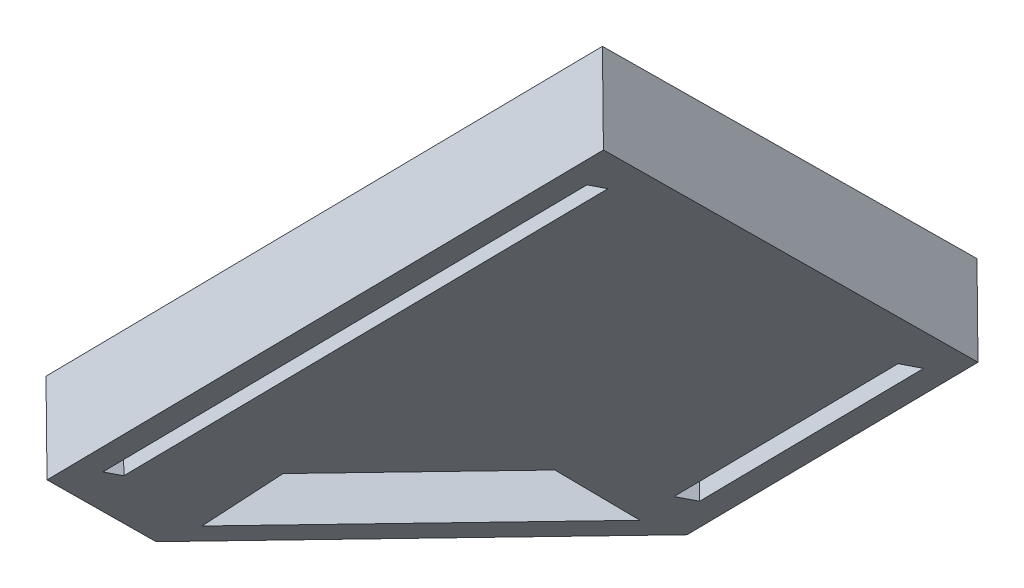
ISO-10303-21;
HEADER;
FILE_DESCRIPTION(('STEP AP214'),'2;1');
FILE_NAME('part.step','',(''),(''),'','','');
FILE_SCHEMA(('AUTOMOTIVE_DESIGN { 1 0 10303 214 1 1 1 1 }'));
ENDSEC;
DATA;
#1=APPLICATION_CONTEXT('core data for automotive mechanical design processes');
#2=APPLICATION_PROTOCOL_DEFINITION('international standard','automotive_design',2000,#1);
#3=PRODUCT_CONTEXT('',#1,'mechanical');
#4=PRODUCT('Part','Part','',(#3));
#5=PRODUCT_RELATED_PRODUCT_CATEGORY('part','',(#4));
#6=PRODUCT_DEFINITION_FORMATION('','',#4);
#7=PRODUCT_DEFINITION_CONTEXT('part definition',#1,'design');
#8=PRODUCT_DEFINITION('design','',#6,#7);
#9=PRODUCT_DEFINITION_SHAPE('','',#8);
#10=(LENGTH_UNIT() NAMED_UNIT(*) SI_UNIT(.MILLI.,.METRE.));
#11=(NAMED_UNIT(*) PLANE_ANGLE_UNIT() SI_UNIT($,.RADIAN.));
#12=(NAMED_UNIT(*) SI_UNIT($,.STERADIAN.) SOLID_ANGLE_UNIT());
#13=UNCERTAINTY_MEASURE_WITH_UNIT(LENGTH_MEASURE(1.E-05),#10,'distance_accuracy_value','');
#14=(GEOMETRIC_REPRESENTATION_CONTEXT(3) GLOBAL_UNCERTAINTY_ASSIGNED_CONTEXT((#13)) GLOBAL_UNIT_ASSIGNED_CONTEXT((#10,
#11,#12)) REPRESENTATION_CONTEXT('',''));
#15=CARTESIAN_POINT('',(0.,0.,0.));
#16=DIRECTION('',(0.,0.,1.));
#17=DIRECTION('',(1.,0.,0.));
#18=AXIS2_PLACEMENT_3D('',#15,#16,#17);
#19=CARTESIAN_POINT('',(-37.467421479638,34.3782294883515,91.1520988927772));
#20=DIRECTION('',(0.406600026719908,-0.401176945515366,-0.820812692798016));
#21=DIRECTION('',(0.0120313227358776,-0.896002387266375,0.443886212092899));
#22=AXIS2_PLACEMENT_3D('',#19,#20,#21);
#23=PLANE('',#22);
#24=DIRECTION('',(0.702343730166737,0.711837962387139,0.));
#25=VECTOR('',#24,1.);
#26=CARTESIAN_POINT('',(-38.3438499317523,35.2429684609935,90.2953027224317));
#27=LINE('',#26,#25);
#28=CARTESIAN_POINT('',(-38.3438499317523,35.2429684609935,90.2953027224317));
#29=VERTEX_POINT('',#28);
#30=CARTESIAN_POINT('',(-27.6123905496012,46.1194949421471,90.2953027224317));
#31=VERTEX_POINT('',#30);
#32=EDGE_CURVE('E233',#29,#31,#27,.T.);
#33=ORIENTED_EDGE('',*,*,#32,.F.);
#34=DIRECTION('',(-0.584285634742841,0.576492648427963,-0.571197446897016));
#35=VECTOR('',#34,1.);
#36=CARTESIAN_POINT('',(-37.467421479638,34.3782294883515,91.1520988927772));
#37=LINE('',#36,#35);
#38=CARTESIAN_POINT('',(-37.467421479638,34.3782294883515,91.1520988927772));
#39=VERTEX_POINT('',#38);
#40=EDGE_CURVE('E263',#39,#29,#37,.T.);
#41=ORIENTED_EDGE('',*,*,#40,.F.);
#42=DIRECTION('',(0.702343730166737,0.711837962387139,0.));
#43=VECTOR('',#42,1.);
#44=CARTESIAN_POINT('',(-37.467421479638,34.3782294883515,91.1520988927772));
#45=LINE('',#44,#43);
#46=CARTESIAN_POINT('',(-26.7359620974869,45.2547559695052,91.1520988927772));
#47=VERTEX_POINT('',#46);
#48=EDGE_CURVE('E248',#39,#47,#45,.T.);
#49=ORIENTED_EDGE('',*,*,#48,.T.);
#50=DIRECTION('',(-0.584285634742841,0.576492648427963,-0.571197446897016));
#51=VECTOR('',#50,1.);
#52=CARTESIAN_POINT('',(-26.7359620974869,45.2547559695052,91.1520988927772));
#53=LINE('',#52,#51);
#54=EDGE_CURVE('E11',#47,#31,#53,.T.);
#55=ORIENTED_EDGE('',*,*,#54,.T.);
#56=EDGE_LOOP('',(#33,#41,#49,#55));
#57=FACE_BOUND('',#56,.T.);
#58=ADVANCED_FACE('F34',(#57),#23,.F.);
#59=CARTESIAN_POINT('',(-26.7359620974869,45.2547559695052,91.1520988927772));
#60=DIRECTION('',(-0.811548086704143,-0.415054115128622,0.411241759165629));
#61=DIRECTION('',(-0.455339697989606,0.00821530440479268,-0.89027988195189));
#62=AXIS2_PLACEMENT_3D('',#59,#60,#61);
#63=PLANE('',#62);
#64=DIRECTION('',(0.,-0.703836847446416,-0.710361662941273));
#65=VECTOR('',#64,1.);
#66=CARTESIAN_POINT('',(-27.6123905496012,46.1194949421471,90.2953027224317));
#67=LINE('',#66,#65);
#68=CARTESIAN_POINT('',(-27.6123905496012,38.961589632534,83.0710411093026));
#69=VERTEX_POINT('',#68);
#70=EDGE_CURVE('E266',#31,#69,#67,.T.);
#71=ORIENTED_EDGE('',*,*,#70,.F.);
#72=ORIENTED_EDGE('',*,*,#54,.F.);
#73=DIRECTION('',(0.,-0.703836847446416,-0.710361662941273));
#74=VECTOR('',#73,1.);
#75=CARTESIAN_POINT('',(-26.7359620974869,45.2547559695052,91.1520988927772));
#76=LINE('',#75,#74);
#77=CARTESIAN_POINT('',(-26.7359620974869,38.096850659892,83.9278372796481));
#78=VERTEX_POINT('',#77);
#79=EDGE_CURVE('E251',#47,#78,#76,.T.);
#80=ORIENTED_EDGE('',*,*,#79,.T.);
#81=DIRECTION('',(-0.584285634742841,0.576492648427963,-0.571197446897016));
#82=VECTOR('',#81,1.);
#83=CARTESIAN_POINT('',(-26.7359620974869,38.096850659892,83.9278372796481));
#84=LINE('',#83,#82);
#85=EDGE_CURVE('E41',#78,#69,#84,.T.);
#86=ORIENTED_EDGE('',*,*,#85,.T.);
#87=EDGE_LOOP('',(#71,#72,#80,#86));
#88=FACE_BOUND('',#87,.T.);
#89=ADVANCED_FACE('F286',(#88),#63,.F.);
#90=CARTESIAN_POINT('',(-26.7359620974869,38.096850659892,83.9278372796481));
#91=DIRECTION('',(-0.406600026719906,0.401176945515368,0.820812692798016));
#92=DIRECTION('',(-0.0120313227358761,0.896002387266374,-0.443886212092901));
#93=AXIS2_PLACEMENT_3D('',#90,#91,#92);
#94=PLANE('',#93);
#95=DIRECTION('',(-0.702343730166737,-0.711837962387139,0.));
#96=VECTOR('',#95,1.);
#97=CARTESIAN_POINT('',(-27.6123905496012,38.961589632534,83.0710411093026));
#98=LINE('',#97,#96);
#99=CARTESIAN_POINT('',(-33.2228855510658,33.2752523616401,83.0710411093026));
#100=VERTEX_POINT('',#99);
#101=EDGE_CURVE('E269',#69,#100,#98,.T.);
#102=ORIENTED_EDGE('',*,*,#101,.F.);
#103=ORIENTED_EDGE('',*,*,#85,.F.);
#104=DIRECTION('',(-0.702343730166737,-0.711837962387139,0.));
#105=VECTOR('',#104,1.);
#106=CARTESIAN_POINT('',(-26.7359620974869,38.096850659892,83.9278372796481));
#107=LINE('',#106,#105);
#108=CARTESIAN_POINT('',(-32.3464570989515,32.4105133889981,83.9278372796481));
#109=VERTEX_POINT('',#108);
#110=EDGE_CURVE('E255',#78,#109,#107,.T.);
#111=ORIENTED_EDGE('',*,*,#110,.T.);
#112=DIRECTION('',(-0.584285634742841,0.576492648427963,-0.571197446897016));
#113=VECTOR('',#112,1.);
#114=CARTESIAN_POINT('',(-32.3464570989515,32.4105133889981,83.9278372796481));
#115=LINE('',#114,#113);
#116=EDGE_CURVE('E281',#109,#100,#115,.T.);
#117=ORIENTED_EDGE('',*,*,#116,.T.);
#118=EDGE_LOOP('',(#102,#103,#111,#117));
#119=FACE_BOUND('',#118,.T.);
#120=ADVANCED_FACE('F299',(#119),#94,.F.);
#121=CARTESIAN_POINT('',(-32.3464570989515,32.4105133889981,83.9278372796481));
#122=DIRECTION('',(0.398420784933302,0.816944659472771,0.416967986171661));
#123=DIRECTION('',(-0.900780352777273,0.434157771354192,0.0100888861234499));
#124=AXIS2_PLACEMENT_3D('',#121,#122,#123);
#125=PLANE('',#124);
#126=DIRECTION('',(-0.707015682404774,-0.0160514693231456,0.707015682404768));
#127=VECTOR('',#126,1.);
#128=CARTESIAN_POINT('',(-33.2228855510658,33.2752523616401,83.0710411093026));
#129=LINE('',#128,#127);
#130=CARTESIAN_POINT('',(-38.3438499317523,33.1589904388749,88.192005489989));
#131=VERTEX_POINT('',#130);
#132=EDGE_CURVE('E272',#100,#131,#129,.T.);
#133=ORIENTED_EDGE('',*,*,#132,.F.);
#134=ORIENTED_EDGE('',*,*,#116,.F.);
#135=DIRECTION('',(-0.707015682404774,-0.0160514693231456,0.707015682404768));
#136=VECTOR('',#135,1.);
#137=CARTESIAN_POINT('',(-32.3464570989515,32.4105133889981,83.9278372796481));
#138=LINE('',#137,#136);
#139=CARTESIAN_POINT('',(-37.467421479638,32.294251466233,89.0488016603346));
#140=VERTEX_POINT('',#139);
#141=EDGE_CURVE('E258',#109,#140,#138,.T.);
#142=ORIENTED_EDGE('',*,*,#141,.T.);
#143=DIRECTION('',(-0.584285634742841,0.576492648427963,-0.571197446897016));
#144=VECTOR('',#143,1.);
#145=CARTESIAN_POINT('',(-37.467421479638,32.294251466233,89.0488016603346));
#146=LINE('',#145,#144);
#147=EDGE_CURVE('E278',#140,#131,#146,.T.);
#148=ORIENTED_EDGE('',*,*,#147,.T.);
#149=EDGE_LOOP('',(#133,#134,#142,#148));
#150=FACE_BOUND('',#149,.T.);
#151=ADVANCED_FACE('F301',(#150),#125,.F.);
#152=CARTESIAN_POINT('',(-37.467421479638,32.294251466233,89.0488016603346));
#153=DIRECTION('',(0.811548086704143,0.415054115128621,-0.41124175916563));
#154=DIRECTION('',(0.455339697989607,-0.00821530440479173,0.89027988195189));
#155=AXIS2_PLACEMENT_3D('',#152,#153,#154);
#156=PLANE('',#155);
#157=DIRECTION('',(0.,0.703836847446416,0.710361662941273));
#158=VECTOR('',#157,1.);
#159=CARTESIAN_POINT('',(-38.3438499317523,33.1589904388749,88.192005489989));
#160=LINE('',#159,#158);
#161=EDGE_CURVE('E252',#131,#29,#160,.T.);
#162=ORIENTED_EDGE('',*,*,#161,.F.);
#163=ORIENTED_EDGE('',*,*,#147,.F.);
#164=DIRECTION('',(0.,0.703836847446416,0.710361662941273));
#165=VECTOR('',#164,1.);
#166=CARTESIAN_POINT('',(-37.467421479638,32.294251466233,89.0488016603346));
#167=LINE('',#166,#165);
#168=EDGE_CURVE('E261',#140,#39,#167,.T.);
#169=ORIENTED_EDGE('',*,*,#168,.T.);
#170=ORIENTED_EDGE('',*,*,#40,.T.);
#171=EDGE_LOOP('',(#162,#163,#169,#170));
#172=FACE_BOUND('',#171,.T.);
#173=ADVANCED_FACE('F303',(#172),#156,.F.);
#174=CARTESIAN_POINT('',(6.05049595475194,-5.96979667109702,5.91496288170103));
#175=DIRECTION('',(0.584285634742841,-0.576492648427963,0.571197446897015));
#176=DIRECTION('',(-0.702343730166737,-0.711837962387139,0.));
#177=AXIS2_PLACEMENT_3D('',#174,#175,#176);
#178=PLANE('',#177);
#179=DIRECTION('',(-0.702343730166737,-0.711837962387139,0.));
#180=VECTOR('',#179,1.);
#181=CARTESIAN_POINT('',(-27.3501522504926,37.9043112613242,84.3617764314093));
#182=LINE('',#181,#180);
#183=CARTESIAN_POINT('',(-27.3501522504926,37.9043112613242,84.3617764314093));
#184=VERTEX_POINT('',#183);
#185=CARTESIAN_POINT('',(-31.6711048119892,33.524948372704,84.3617764314092));
#186=VERTEX_POINT('',#185);
#187=EDGE_CURVE('E182',#184,#186,#182,.T.);
#188=ORIENTED_EDGE('',*,*,#187,.T.);
#189=DIRECTION('',(-0.406600026719916,0.401176945515355,0.820812692798018));
#190=VECTOR('',#189,1.);
#191=CARTESIAN_POINT('',(-31.6711048119892,33.524948372704,84.3617764314093));
#192=LINE('',#191,#190);
#193=CARTESIAN_POINT('',(-31.834892251933,33.6865512761777,84.6924178499828));
#194=VERTEX_POINT('',#193);
#195=EDGE_CURVE('E167',#186,#194,#192,.T.);
#196=ORIENTED_EDGE('',*,*,#195,.T.);
#197=DIRECTION('',(0.702343730166737,0.711837962387139,0.));
#198=VECTOR('',#197,1.);
#199=CARTESIAN_POINT('',(-27.5139396904363,38.0659141647978,84.6924178499828));
#200=LINE('',#199,#198);
#201=CARTESIAN_POINT('',(-27.5139396904363,38.0659141647978,84.6924178499828));
#202=VERTEX_POINT('',#201);
#203=EDGE_CURVE('E177',#194,#202,#200,.T.);
#204=ORIENTED_EDGE('',*,*,#203,.T.);
#205=DIRECTION('',(0.406600026719913,-0.401176945515369,-0.820812692798012));
#206=VECTOR('',#205,1.);
#207=CARTESIAN_POINT('',(-27.3501522504926,37.9043112613242,84.3617764314093));
#208=LINE('',#207,#206);
#209=EDGE_CURVE('E174',#202,#184,#208,.T.);
#210=ORIENTED_EDGE('',*,*,#209,.T.);
#211=EDGE_LOOP('',(#188,#196,#204,#210));
#212=FACE_BOUND('',#211,.T.);
#213=DIRECTION('',(-0.702343730166737,-0.711837962387139,0.));
#214=VECTOR('',#213,1.);
#215=CARTESIAN_POINT('',(-27.3378202305194,43.9626004656998,90.4636135197738));
#216=LINE('',#215,#214);
#217=CARTESIAN_POINT('',(-27.3378202305194,43.9626004656998,90.4636135197738));
#218=VERTEX_POINT('',#217);
#219=CARTESIAN_POINT('',(-36.6741641580667,34.5000485099032,90.4636135197738));
#220=VERTEX_POINT('',#219);
#221=EDGE_CURVE('E202',#218,#220,#216,.T.);
#222=ORIENTED_EDGE('',*,*,#221,.T.);
#223=DIRECTION('',(-0.406600026719896,0.401176945515356,0.820812692798027));
#224=VECTOR('',#223,1.);
#225=CARTESIAN_POINT('',(-36.6741641580667,34.5000485099032,90.4636135197738));
#226=LINE('',#225,#224);
#227=CARTESIAN_POINT('',(-36.8081720634836,34.632269067299,90.7341383168054));
#228=VERTEX_POINT('',#227);
#229=EDGE_CURVE('E205',#220,#228,#226,.T.);
#230=ORIENTED_EDGE('',*,*,#229,.T.);
#231=DIRECTION('',(0.702343730166737,0.711837962387139,0.));
#232=VECTOR('',#231,1.);
#233=CARTESIAN_POINT('',(-27.4718281359363,44.0948210230957,90.7341383168054));
#234=LINE('',#233,#232);
#235=CARTESIAN_POINT('',(-27.4718281359363,44.0948210230957,90.7341383168054));
#236=VERTEX_POINT('',#235);
#237=EDGE_CURVE('E208',#228,#236,#234,.T.);
#238=ORIENTED_EDGE('',*,*,#237,.T.);
#239=DIRECTION('',(0.406600026719896,-0.401176945515356,-0.820812692798027));
#240=VECTOR('',#239,1.);
#241=CARTESIAN_POINT('',(-27.3378202305194,43.9626004656998,90.4636135197738));
#242=LINE('',#241,#240);
#243=EDGE_CURVE('E196',#236,#218,#242,.T.);
#244=ORIENTED_EDGE('',*,*,#243,.T.);
#245=EDGE_LOOP('',(#222,#230,#238,#244));
#246=FACE_BOUND('',#245,.T.);
#247=DIRECTION('',(-0.0138643010416872,-0.710824819862271,-0.703232434280726));
#248=VECTOR('',#247,1.);
#249=CARTESIAN_POINT('',(-32.51649142869,34.5968591264773,86.3083816399996));
#250=LINE('',#249,#248);
#251=CARTESIAN_POINT('',(-32.51649142869,34.5968591264773,86.3083816399996));
#252=VERTEX_POINT('',#251);
#253=CARTESIAN_POINT('',(-32.5495339534111,32.9027638661357,84.6323811676691));
#254=VERTEX_POINT('',#253);
#255=EDGE_CURVE('E189',#252,#254,#250,.T.);
#256=ORIENTED_EDGE('',*,*,#255,.T.);
#257=DIRECTION('',(-0.707015682404773,-0.0160514693231488,0.707015682404769));
#258=VECTOR('',#257,1.);
#259=CARTESIAN_POINT('',(-32.5495339534111,32.9027638661357,84.6323811676691));
#260=LINE('',#259,#258);
#261=CARTESIAN_POINT('',(-36.774284187238,32.8068488101279,88.857131401496));
#262=VERTEX_POINT('',#261);
#263=EDGE_CURVE('E221',#254,#262,#260,.T.);
#264=ORIENTED_EDGE('',*,*,#263,.T.);
#265=DIRECTION('',(0.686921028079519,0.726105314589122,0.0301757072428968));
#266=VECTOR('',#265,1.);
#267=CARTESIAN_POINT('',(-36.774284187238,32.8068488101279,88.857131401496));
#268=LINE('',#267,#266);
#269=CARTESIAN_POINT('',(-35.1371583787668,34.5373617826386,88.9290485900763));
#270=VERTEX_POINT('',#269);
#271=EDGE_CURVE('E224',#262,#270,#268,.T.);
#272=ORIENTED_EDGE('',*,*,#271,.T.);
#273=DIRECTION('',(0.707015682404774,0.0160514693231474,-0.707015682404769));
#274=VECTOR('',#273,1.);
#275=CARTESIAN_POINT('',(-35.1371583787668,34.5373617826386,88.9290485900763));
#276=LINE('',#275,#274);
#277=EDGE_CURVE('E227',#270,#252,#276,.T.);
#278=ORIENTED_EDGE('',*,*,#277,.T.);
#279=EDGE_LOOP('',(#256,#264,#272,#278));
#280=FACE_BOUND('',#279,.T.);
#281=ORIENTED_EDGE('',*,*,#48,.F.);
#282=ORIENTED_EDGE('',*,*,#168,.F.);
#283=ORIENTED_EDGE('',*,*,#141,.F.);
#284=ORIENTED_EDGE('',*,*,#110,.F.);
#285=ORIENTED_EDGE('',*,*,#79,.F.);
#286=EDGE_LOOP('',(#281,#282,#283,#284,#285));
#287=FACE_BOUND('',#286,.T.);
#288=ADVANCED_FACE('F296',(#212,#246,#280,#287),#178,.T.);
#289=CARTESIAN_POINT('',(5.17406750263768,-5.10505769845507,5.05816671135551));
#290=DIRECTION('',(0.584285634742841,-0.576492648427963,0.571197446897015));
#291=DIRECTION('',(-0.702343730166737,-0.711837962387139,0.));
#292=AXIS2_PLACEMENT_3D('',#289,#290,#291);
#293=PLANE('',#292);
#294=ORIENTED_EDGE('',*,*,#32,.T.);
#295=ORIENTED_EDGE('',*,*,#70,.T.);
#296=ORIENTED_EDGE('',*,*,#101,.T.);
#297=ORIENTED_EDGE('',*,*,#132,.T.);
#298=ORIENTED_EDGE('',*,*,#161,.T.);
#299=EDGE_LOOP('',(#294,#295,#296,#297,#298));
#300=FACE_BOUND('',#299,.T.);
#301=ADVANCED_FACE('F290',(#300),#293,.F.);
#302=CARTESIAN_POINT('',(-32.51649142869,34.5968591264773,86.3083816399996));
#303=DIRECTION('',(0.518626346369149,0.59618887096382,-0.612850343061561));
#304=DIRECTION('',(0.604585773245261,-0.76255397252061,-0.230190099227717));
#305=AXIS2_PLACEMENT_3D('',#302,#303,#304);
#306=PLANE('',#305);
#307=ORIENTED_EDGE('',*,*,#255,.F.);
#308=DIRECTION('',(0.835765029626385,-0.202311039264523,0.510457695255264));
#309=VECTOR('',#308,1.);
#310=CARTESIAN_POINT('',(-33.2189395754091,34.7668985628673,85.879349496634));
#311=LINE('',#310,#309);
#312=CARTESIAN_POINT('',(-33.6351598038321,34.8676516980072,85.6251359186689));
#313=VERTEX_POINT('',#312);
#314=EDGE_CURVE('E231',#313,#252,#311,.T.);
#315=ORIENTED_EDGE('',*,*,#314,.F.);
#316=DIRECTION('',(-0.0138643010416873,-0.710824819862271,-0.703232434280726));
#317=VECTOR('',#316,1.);
#318=CARTESIAN_POINT('',(-34.8071485042387,-25.2203869519208,26.1789031617279));
#319=LINE('',#318,#317);
#320=CARTESIAN_POINT('',(-33.6521422327525,33.996959988282,84.7637441475476));
#321=VERTEX_POINT('',#320);
#322=EDGE_CURVE('E230',#313,#321,#319,.T.);
#323=ORIENTED_EDGE('',*,*,#322,.T.);
#324=DIRECTION('',(0.707284771802055,-0.701888666228026,-0.0842647719842483));
#325=VECTOR('',#324,1.);
#326=CARTESIAN_POINT('',(-33.4739011035802,33.8200787186584,84.7425087856302));
#327=LINE('',#326,#325);
#328=EDGE_CURVE('E235',#321,#254,#327,.T.);
#329=ORIENTED_EDGE('',*,*,#328,.T.);
#330=EDGE_LOOP('',(#307,#315,#323,#329));
#331=FACE_BOUND('',#330,.T.);
#332=ADVANCED_FACE('F349',(#331),#306,.F.);
#333=CARTESIAN_POINT('',(-35.1371583787668,34.5373617826386,88.9290485900763));
#334=DIRECTION('',(0.138449680824293,0.977255147132765,0.160636431989042));
#335=DIRECTION('',(0.693793586611685,0.0200417068161911,-0.719894984816806));
#336=AXIS2_PLACEMENT_3D('',#333,#334,#335);
#337=PLANE('',#336);
#338=ORIENTED_EDGE('',*,*,#277,.F.);
#339=DIRECTION('',(0.515133421104375,-0.209590380524278,0.831089303777273));
#340=VECTOR('',#339,1.);
#341=CARTESIAN_POINT('',(-35.4155410911462,34.6506263005841,88.4799204901774));
#342=LINE('',#341,#340);
#343=CARTESIAN_POINT('',(-35.8266625417082,34.8178977252962,87.816638656545));
#344=VERTEX_POINT('',#343);
#345=EDGE_CURVE('E234',#344,#270,#342,.T.);
#346=ORIENTED_EDGE('',*,*,#345,.F.);
#347=DIRECTION('',(0.707015682404773,0.0160514693231478,-0.70701568240477));
#348=VECTOR('',#347,1.);
#349=CARTESIAN_POINT('',(25.5839239241595,36.2121102856466,26.4060521906776));
#350=LINE('',#349,#348);
#351=EDGE_CURVE('E238',#344,#313,#350,.T.);
#352=ORIENTED_EDGE('',*,*,#351,.T.);
#353=ORIENTED_EDGE('',*,*,#314,.T.);
#354=EDGE_LOOP('',(#338,#346,#352,#353));
#355=FACE_BOUND('',#354,.T.);
#356=ADVANCED_FACE('F357',(#355),#337,.F.);
#357=CARTESIAN_POINT('',(-36.774284187238,32.8068488101279,88.857131401496));
#358=DIRECTION('',(-0.626090684846409,0.570200210786233,0.531866688153988));
#359=DIRECTION('',(0.198610034882353,0.776216564272214,-0.598366024598214));
#360=AXIS2_PLACEMENT_3D('',#357,#358,#359);
#361=PLANE('',#360);
#362=ORIENTED_EDGE('',*,*,#271,.F.);
#363=DIRECTION('',(-0.0681298651673601,-0.719493005944651,0.691149864985162));
#364=VECTOR('',#363,1.);
#365=CARTESIAN_POINT('',(-36.5510377827852,35.1644672526648,86.5923871235353));
#366=LINE('',#365,#364);
#367=CARTESIAN_POINT('',(-36.6680744165787,33.9284888862482,87.7796763313738));
#368=VERTEX_POINT('',#367);
#369=EDGE_CURVE('E237',#368,#262,#366,.T.);
#370=ORIENTED_EDGE('',*,*,#369,.F.);
#371=DIRECTION('',(0.686921028079519,0.726105314589122,0.0301757072428986));
#372=VECTOR('',#371,1.);
#373=CARTESIAN_POINT('',(-38.1081346536442,32.4062827683411,87.7164160229111));
#374=LINE('',#373,#372);
#375=EDGE_CURVE('E245',#368,#344,#374,.T.);
#376=ORIENTED_EDGE('',*,*,#375,.T.);
#377=ORIENTED_EDGE('',*,*,#345,.T.);
#378=EDGE_LOOP('',(#362,#370,#376,#377));
#379=FACE_BOUND('',#378,.T.);
#380=ADVANCED_FACE('F367',(#379),#361,.F.);
#381=CARTESIAN_POINT('',(-32.5495339534111,32.9027638661357,84.6323811676691));
#382=DIRECTION('',(-0.595046851670576,-0.526747900960708,-0.607005678021568));
#383=DIRECTION('',(0.767914893366072,-0.595474238212331,-0.236044801196761));
#384=AXIS2_PLACEMENT_3D('',#381,#382,#383);
#385=PLANE('',#384);
#386=ORIENTED_EDGE('',*,*,#263,.F.);
#387=ORIENTED_EDGE('',*,*,#328,.F.);
#388=DIRECTION('',(-0.707015682404773,-0.0160514693231489,0.707015682404769));
#389=VECTOR('',#388,1.);
#390=CARTESIAN_POINT('',(25.154726772264,35.33206001126,25.9568751425315));
#391=LINE('',#390,#389);
#392=EDGE_CURVE('E243',#321,#368,#391,.T.);
#393=ORIENTED_EDGE('',*,*,#392,.T.);
#394=ORIENTED_EDGE('',*,*,#369,.T.);
#395=EDGE_LOOP('',(#386,#387,#393,#394));
#396=FACE_BOUND('',#395,.T.);
#397=ADVANCED_FACE('F377',(#396),#385,.F.);
#398=CARTESIAN_POINT('',(5.34935319306047,-5.27800549298342,5.22952594542453));
#399=DIRECTION('',(0.584285634742842,-0.576492648427964,0.571197446897014));
#400=DIRECTION('',(-0.702343730166737,-0.711837962387139,0.));
#401=AXIS2_PLACEMENT_3D('',#398,#399,#400);
#402=PLANE('',#401);
#403=ORIENTED_EDGE('',*,*,#322,.F.);
#404=ORIENTED_EDGE('',*,*,#351,.F.);
#405=ORIENTED_EDGE('',*,*,#375,.F.);
#406=ORIENTED_EDGE('',*,*,#392,.F.);
#407=EDGE_LOOP('',(#403,#404,#405,#406));
#408=FACE_BOUND('',#407,.T.);
#409=ADVANCED_FACE('F387',(#408),#402,.T.);
#410=CARTESIAN_POINT('',(-27.6299630478908,44.2508467899138,90.1780147963253));
#411=DIRECTION('',(0.406600026719907,-0.401176945515366,-0.820812692798017));
#412=DIRECTION('',(0.0120313227358784,-0.896002387266375,0.443886212092899));
#413=AXIS2_PLACEMENT_3D('',#410,#411,#412);
#414=PLANE('',#413);
#415=ORIENTED_EDGE('',*,*,#221,.F.);
#416=DIRECTION('',(0.584285634742841,-0.576492648427963,0.571197446897015));
#417=VECTOR('',#416,1.);
#418=CARTESIAN_POINT('',(-27.6299630478908,44.2508467899138,90.1780147963253));
#419=LINE('',#418,#417);
#420=CARTESIAN_POINT('',(-27.6299630478908,44.2508467899138,90.1780147963253));
#421=VERTEX_POINT('',#420);
#422=EDGE_CURVE('E184',#421,#218,#419,.T.);
#423=ORIENTED_EDGE('',*,*,#422,.F.);
#424=DIRECTION('',(-0.702343730166737,-0.711837962387139,0.));
#425=VECTOR('',#424,1.);
#426=CARTESIAN_POINT('',(-27.6299630478908,44.2508467899138,90.1780147963253));
#427=LINE('',#426,#425);
#428=CARTESIAN_POINT('',(-36.9663069754381,34.7882948341171,90.1780147963253));
#429=VERTEX_POINT('',#428);
#430=EDGE_CURVE('E193',#421,#429,#427,.T.);
#431=ORIENTED_EDGE('',*,*,#430,.T.);
#432=DIRECTION('',(0.584285634742841,-0.576492648427963,0.571197446897015));
#433=VECTOR('',#432,1.);
#434=CARTESIAN_POINT('',(-36.9663069754381,34.7882948341171,90.1780147963253));
#435=LINE('',#434,#433);
#436=EDGE_CURVE('E56',#429,#220,#435,.T.);
#437=ORIENTED_EDGE('',*,*,#436,.T.);
#438=EDGE_LOOP('',(#415,#423,#431,#437));
#439=FACE_BOUND('',#438,.T.);
#440=ADVANCED_FACE('F397',(#439),#414,.F.);
#441=CARTESIAN_POINT('',(-27.6299630478908,44.2508467899138,90.1780147963253));
#442=DIRECTION('',(0.702343730166737,0.711837962387139,0.));
#443=DIRECTION('',(0.247340168045802,-0.244041236102097,0.937692229013782));
#444=AXIS2_PLACEMENT_3D('',#441,#442,#443);
#445=PLANE('',#444);
#446=ORIENTED_EDGE('',*,*,#243,.F.);
#447=DIRECTION('',(0.584285634742841,-0.576492648427963,0.571197446897015));
#448=VECTOR('',#447,1.);
#449=CARTESIAN_POINT('',(-27.7639709533077,44.3830673473096,90.4485395933569));
#450=LINE('',#449,#448);
#451=CARTESIAN_POINT('',(-27.7639709533077,44.3830673473096,90.4485395933569));
#452=VERTEX_POINT('',#451);
#453=EDGE_CURVE('E214',#452,#236,#450,.T.);
#454=ORIENTED_EDGE('',*,*,#453,.F.);
#455=DIRECTION('',(0.406600026719896,-0.401176945515356,-0.820812692798027));
#456=VECTOR('',#455,1.);
#457=CARTESIAN_POINT('',(-27.6299630478908,44.2508467899138,90.1780147963253));
#458=LINE('',#457,#456);
#459=EDGE_CURVE('E200',#452,#421,#458,.T.);
#460=ORIENTED_EDGE('',*,*,#459,.T.);
#461=ORIENTED_EDGE('',*,*,#422,.T.);
#462=EDGE_LOOP('',(#446,#454,#460,#461));
#463=FACE_BOUND('',#462,.T.);
#464=ADVANCED_FACE('F407',(#463),#445,.F.);
#465=CARTESIAN_POINT('',(-27.7639709533077,44.3830673473096,90.4485395933569));
#466=DIRECTION('',(-0.406600026719907,0.401176945515366,0.820812692798017));
#467=DIRECTION('',(-0.0120313227358784,0.896002387266375,-0.443886212092899));
#468=AXIS2_PLACEMENT_3D('',#465,#466,#467);
#469=PLANE('',#468);
#470=ORIENTED_EDGE('',*,*,#237,.F.);
#471=DIRECTION('',(0.584285634742841,-0.576492648427963,0.571197446897015));
#472=VECTOR('',#471,1.);
#473=CARTESIAN_POINT('',(-37.100314880855,34.920515391513,90.4485395933569));
#474=LINE('',#473,#472);
#475=CARTESIAN_POINT('',(-37.100314880855,34.920515391513,90.4485395933569));
#476=VERTEX_POINT('',#475);
#477=EDGE_CURVE('E216',#476,#228,#474,.T.);
#478=ORIENTED_EDGE('',*,*,#477,.F.);
#479=DIRECTION('',(0.702343730166737,0.711837962387139,0.));
#480=VECTOR('',#479,1.);
#481=CARTESIAN_POINT('',(-27.7639709533077,44.3830673473096,90.4485395933569));
#482=LINE('',#481,#480);
#483=EDGE_CURVE('E198',#476,#452,#482,.T.);
#484=ORIENTED_EDGE('',*,*,#483,.T.);
#485=ORIENTED_EDGE('',*,*,#453,.T.);
#486=EDGE_LOOP('',(#470,#478,#484,#485));
#487=FACE_BOUND('',#486,.T.);
#488=ADVANCED_FACE('F416',(#487),#469,.F.);
#489=CARTESIAN_POINT('',(-36.9663069754381,34.7882948341171,90.1780147963253));
#490=DIRECTION('',(-0.702343730166737,-0.711837962387139,0.));
#491=DIRECTION('',(-0.247340168045802,0.244041236102097,-0.937692229013782));
#492=AXIS2_PLACEMENT_3D('',#489,#490,#491);
#493=PLANE('',#492);
#494=ORIENTED_EDGE('',*,*,#229,.F.);
#495=ORIENTED_EDGE('',*,*,#436,.F.);
#496=DIRECTION('',(-0.406600026719896,0.401176945515356,0.820812692798027));
#497=VECTOR('',#496,1.);
#498=CARTESIAN_POINT('',(-36.9663069754381,34.7882948341171,90.1780147963253));
#499=LINE('',#498,#497);
#500=EDGE_CURVE('E195',#429,#476,#499,.T.);
#501=ORIENTED_EDGE('',*,*,#500,.T.);
#502=ORIENTED_EDGE('',*,*,#477,.T.);
#503=EDGE_LOOP('',(#494,#495,#501,#502));
#504=FACE_BOUND('',#503,.T.);
#505=ADVANCED_FACE('F426',(#504),#493,.F.);
#506=CARTESIAN_POINT('',(5.75835313737956,-5.68155034688209,5.6293641582513));
#507=DIRECTION('',(0.584285634742848,-0.57649264842797,0.571197446897));
#508=DIRECTION('',(-0.702343730166737,-0.711837962387139,0.));
#509=AXIS2_PLACEMENT_3D('',#506,#507,#508);
#510=PLANE('',#509);
#511=ORIENTED_EDGE('',*,*,#430,.F.);
#512=ORIENTED_EDGE('',*,*,#459,.F.);
#513=ORIENTED_EDGE('',*,*,#483,.F.);
#514=ORIENTED_EDGE('',*,*,#500,.F.);
#515=EDGE_LOOP('',(#511,#512,#513,#514));
#516=FACE_BOUND('',#515,.T.);
#517=ADVANCED_FACE('F436',(#516),#510,.T.);
#518=CARTESIAN_POINT('',(-27.642295067864,38.1925575855381,84.0761777079607));
#519=DIRECTION('',(0.406600026719907,-0.401176945515366,-0.820812692798017));
#520=DIRECTION('',(0.0120313227358784,-0.896002387266375,0.443886212092899));
#521=AXIS2_PLACEMENT_3D('',#518,#519,#520);
#522=PLANE('',#521);
#523=ORIENTED_EDGE('',*,*,#187,.F.);
#524=DIRECTION('',(0.584285634742841,-0.576492648427963,0.571197446897015));
#525=VECTOR('',#524,1.);
#526=CARTESIAN_POINT('',(-27.642295067864,38.1925575855381,84.0761777079607));
#527=LINE('',#526,#525);
#528=CARTESIAN_POINT('',(-27.642295067864,38.1925575855381,84.0761777079607));
#529=VERTEX_POINT('',#528);
#530=EDGE_CURVE('E173',#529,#184,#527,.T.);
#531=ORIENTED_EDGE('',*,*,#530,.F.);
#532=DIRECTION('',(-0.702343730166737,-0.711837962387139,0.));
#533=VECTOR('',#532,1.);
#534=CARTESIAN_POINT('',(-27.642295067864,38.1925575855381,84.0761777079607));
#535=LINE('',#534,#533);
#536=CARTESIAN_POINT('',(-31.9632476293607,33.813194696918,84.0761777079607));
#537=VERTEX_POINT('',#536);
#538=EDGE_CURVE('E159',#529,#537,#535,.T.);
#539=ORIENTED_EDGE('',*,*,#538,.T.);
#540=DIRECTION('',(0.584285634742841,-0.576492648427963,0.571197446897015));
#541=VECTOR('',#540,1.);
#542=CARTESIAN_POINT('',(-31.9632476293607,33.813194696918,84.0761777079607));
#543=LINE('',#542,#541);
#544=EDGE_CURVE('E48',#537,#186,#543,.T.);
#545=ORIENTED_EDGE('',*,*,#544,.T.);
#546=EDGE_LOOP('',(#523,#531,#539,#545));
#547=FACE_BOUND('',#546,.T.);
#548=ADVANCED_FACE('F172',(#547),#522,.F.);
#549=CARTESIAN_POINT('',(-27.642295067864,38.1925575855381,84.0761777079607));
#550=DIRECTION('',(0.702343730166736,0.71183796238714,0.));
#551=DIRECTION('',(0.247340168045801,-0.244041236102098,0.937692229013782));
#552=AXIS2_PLACEMENT_3D('',#549,#550,#551);
#553=PLANE('',#552);
#554=ORIENTED_EDGE('',*,*,#209,.F.);
#555=DIRECTION('',(0.584285634742841,-0.576492648427963,0.571197446897015));
#556=VECTOR('',#555,1.);
#557=CARTESIAN_POINT('',(-27.8060825078078,38.3541604890118,84.4068191265342));
#558=LINE('',#557,#556);
#559=CARTESIAN_POINT('',(-27.8060825078078,38.3541604890118,84.4068191265342));
#560=VERTEX_POINT('',#559);
#561=EDGE_CURVE('E190',#560,#202,#558,.T.);
#562=ORIENTED_EDGE('',*,*,#561,.F.);
#563=DIRECTION('',(0.406600026719913,-0.401176945515369,-0.820812692798012));
#564=VECTOR('',#563,1.);
#565=CARTESIAN_POINT('',(-27.642295067864,38.1925575855381,84.0761777079607));
#566=LINE('',#565,#564);
#567=EDGE_CURVE('E170',#560,#529,#566,.T.);
#568=ORIENTED_EDGE('',*,*,#567,.T.);
#569=ORIENTED_EDGE('',*,*,#530,.T.);
#570=EDGE_LOOP('',(#554,#562,#568,#569));
#571=FACE_BOUND('',#570,.T.);
#572=ADVANCED_FACE('F455',(#571),#553,.F.);
#573=CARTESIAN_POINT('',(-27.8060825078078,38.3541604890118,84.4068191265342));
#574=DIRECTION('',(-0.406600026719907,0.401176945515366,0.820812692798017));
#575=DIRECTION('',(-0.0120313227358781,0.896002387266375,-0.443886212092899));
#576=AXIS2_PLACEMENT_3D('',#573,#574,#575);
#577=PLANE('',#576);
#578=ORIENTED_EDGE('',*,*,#203,.F.);
#579=DIRECTION('',(0.584285634742841,-0.576492648427963,0.571197446897015));
#580=VECTOR('',#579,1.);
#581=CARTESIAN_POINT('',(-32.1270350693044,33.9747976003917,84.4068191265343));
#582=LINE('',#581,#580);
#583=CARTESIAN_POINT('',(-32.1270350693044,33.9747976003917,84.4068191265343));
#584=VERTEX_POINT('',#583);
#585=EDGE_CURVE('E169',#584,#194,#582,.T.);
#586=ORIENTED_EDGE('',*,*,#585,.F.);
#587=DIRECTION('',(0.702343730166737,0.711837962387139,0.));
#588=VECTOR('',#587,1.);
#589=CARTESIAN_POINT('',(-27.8060825078078,38.3541604890118,84.4068191265342));
#590=LINE('',#589,#588);
#591=EDGE_CURVE('E161',#584,#560,#590,.T.);
#592=ORIENTED_EDGE('',*,*,#591,.T.);
#593=ORIENTED_EDGE('',*,*,#561,.T.);
#594=EDGE_LOOP('',(#578,#586,#592,#593));
#595=FACE_BOUND('',#594,.T.);
#596=ADVANCED_FACE('F464',(#595),#577,.F.);
#597=CARTESIAN_POINT('',(-31.9632476293607,33.813194696918,84.0761777079607));
#598=DIRECTION('',(-0.702343730166731,-0.711837962387145,0.));
#599=DIRECTION('',(-0.247340168045796,0.244041236102103,-0.937692229013782));
#600=AXIS2_PLACEMENT_3D('',#597,#598,#599);
#601=PLANE('',#600);
#602=ORIENTED_EDGE('',*,*,#195,.F.);
#603=ORIENTED_EDGE('',*,*,#544,.F.);
#604=DIRECTION('',(-0.406600026719916,0.401176945515355,0.820812692798018));
#605=VECTOR('',#604,1.);
#606=CARTESIAN_POINT('',(-31.9632476293607,33.813194696918,84.0761777079607));
#607=LINE('',#606,#605);
#608=EDGE_CURVE('E156',#537,#584,#607,.T.);
#609=ORIENTED_EDGE('',*,*,#608,.T.);
#610=ORIENTED_EDGE('',*,*,#585,.T.);
#611=EDGE_LOOP('',(#602,#603,#609,#610));
#612=FACE_BOUND('',#611,.T.);
#613=ADVANCED_FACE('F165',(#612),#601,.F.);
#614=CARTESIAN_POINT('',(5.75835313738043,-5.68155034688296,5.6293641582524));
#615=DIRECTION('',(0.584285634742842,-0.576492648427964,0.571197446897013));
#616=DIRECTION('',(-0.702343730166737,-0.711837962387139,0.));
#617=AXIS2_PLACEMENT_3D('',#614,#615,#616);
#618=PLANE('',#617);
#619=ORIENTED_EDGE('',*,*,#538,.F.);
#620=ORIENTED_EDGE('',*,*,#567,.F.);
#621=ORIENTED_EDGE('',*,*,#591,.F.);
#622=ORIENTED_EDGE('',*,*,#608,.F.);
#623=EDGE_LOOP('',(#619,#620,#621,#622));
#624=FACE_BOUND('',#623,.T.);
#625=ADVANCED_FACE('F157',(#624),#618,.T.);
#626=CLOSED_SHELL('',(#58,#89,#120,#151,#173,#288,#301,#332,#356,#380,#397,#409,#440,#464,#488,
#505,#517,#548,#572,#596,#613,#625));
#627=MANIFOLD_SOLID_BREP('B2',#626);
#628=ADVANCED_BREP_SHAPE_REPRESENTATION('',(#18,#627),#14);
#629=SHAPE_DEFINITION_REPRESENTATION(#9,#628);
ENDSEC;
END-ISO-10303-21;
